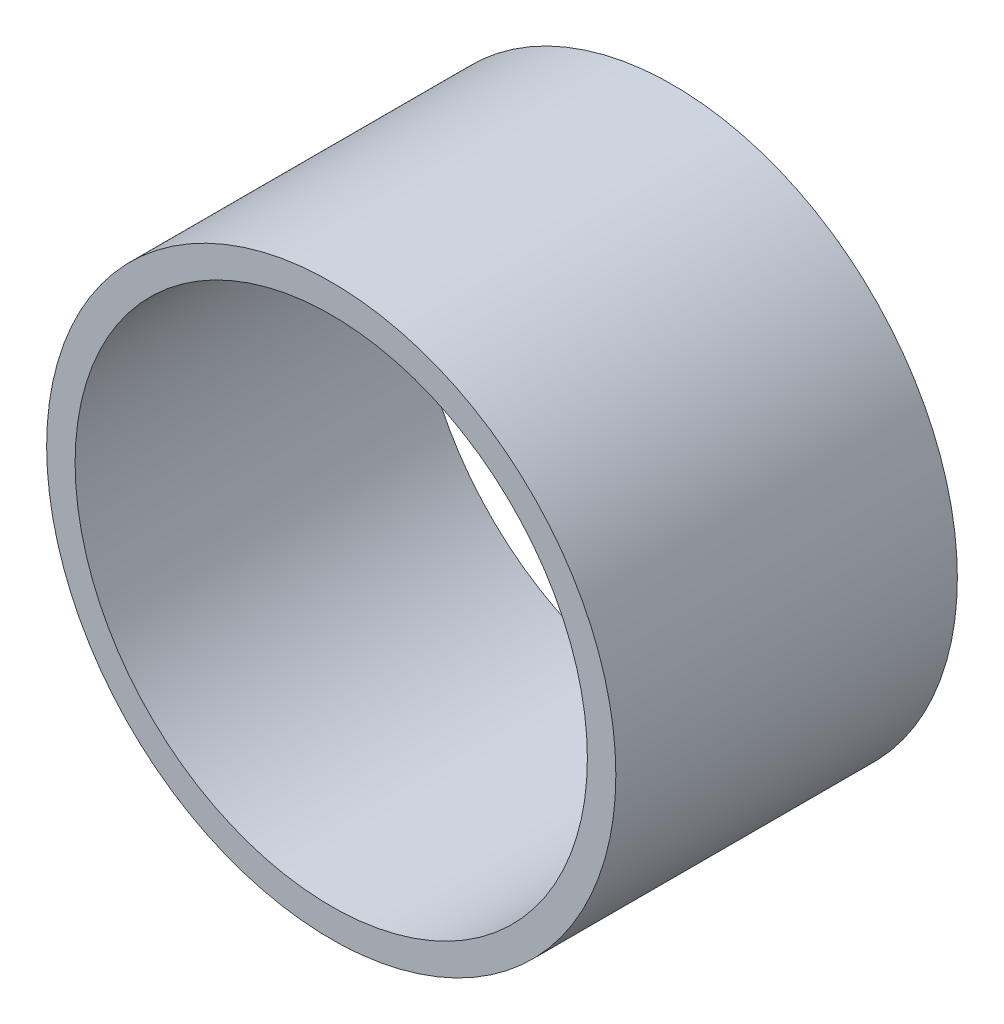
ISO-10303-21;
HEADER;
FILE_DESCRIPTION(('STEP AP214'),'2;1');
FILE_NAME('part.step','',(''),(''),'','','');
FILE_SCHEMA(('AUTOMOTIVE_DESIGN { 1 0 10303 214 1 1 1 1 }'));
ENDSEC;
DATA;
#1=APPLICATION_CONTEXT('core data for automotive mechanical design processes');
#2=APPLICATION_PROTOCOL_DEFINITION('international standard','automotive_design',2000,#1);
#3=PRODUCT_CONTEXT('',#1,'mechanical');
#4=PRODUCT('Part','Part','',(#3));
#5=PRODUCT_RELATED_PRODUCT_CATEGORY('part','',(#4));
#6=PRODUCT_DEFINITION_FORMATION('','',#4);
#7=PRODUCT_DEFINITION_CONTEXT('part definition',#1,'design');
#8=PRODUCT_DEFINITION('design','',#6,#7);
#9=PRODUCT_DEFINITION_SHAPE('','',#8);
#10=(LENGTH_UNIT() NAMED_UNIT(*) SI_UNIT(.MILLI.,.METRE.));
#11=(NAMED_UNIT(*) PLANE_ANGLE_UNIT() SI_UNIT($,.RADIAN.));
#12=(NAMED_UNIT(*) SI_UNIT($,.STERADIAN.) SOLID_ANGLE_UNIT());
#13=UNCERTAINTY_MEASURE_WITH_UNIT(LENGTH_MEASURE(1.E-05),#10,'distance_accuracy_value','');
#14=(GEOMETRIC_REPRESENTATION_CONTEXT(3) GLOBAL_UNCERTAINTY_ASSIGNED_CONTEXT((#13)) GLOBAL_UNIT_ASSIGNED_CONTEXT((#10,
#11,#12)) REPRESENTATION_CONTEXT('',''));
#15=CARTESIAN_POINT('',(0.,0.,0.));
#16=DIRECTION('',(0.,0.,1.));
#17=DIRECTION('',(1.,0.,0.));
#18=AXIS2_PLACEMENT_3D('',#15,#16,#17);
#19=CARTESIAN_POINT('',(0.,0.,30.));
#20=DIRECTION('',(0.,0.,1.));
#21=DIRECTION('',(1.,0.,0.));
#22=AXIS2_PLACEMENT_3D('',#19,#20,#21);
#23=PLANE('',#22);
#24=CARTESIAN_POINT('',(0.,0.,30.));
#25=DIRECTION('',(0.,0.,1.));
#26=DIRECTION('',(1.,0.,0.));
#27=AXIS2_PLACEMENT_3D('',#24,#25,#26);
#28=CIRCLE('',#27,25.);
#29=CARTESIAN_POINT('',(25.,0.,30.));
#30=VERTEX_POINT('',#29);
#31=EDGE_CURVE('E10',#30,#30,#28,.T.);
#32=ORIENTED_EDGE('',*,*,#31,.T.);
#33=EDGE_LOOP('',(#32));
#34=FACE_BOUND('',#33,.T.);
#35=CARTESIAN_POINT('',(0.,0.,30.));
#36=DIRECTION('',(0.,0.,1.));
#37=DIRECTION('',(1.,0.,0.));
#38=AXIS2_PLACEMENT_3D('',#35,#36,#37);
#39=CIRCLE('',#38,22.5);
#40=CARTESIAN_POINT('',(22.5,0.,30.));
#41=VERTEX_POINT('',#40);
#42=EDGE_CURVE('E42',#41,#41,#39,.T.);
#43=ORIENTED_EDGE('',*,*,#42,.F.);
#44=EDGE_LOOP('',(#43));
#45=FACE_BOUND('',#44,.T.);
#46=ADVANCED_FACE('F31',(#34,#45),#23,.T.);
#47=CARTESIAN_POINT('',(0.,0.,0.));
#48=DIRECTION('',(0.,0.,1.));
#49=DIRECTION('',(1.,0.,0.));
#50=AXIS2_PLACEMENT_3D('',#47,#48,#49);
#51=PLANE('',#50);
#52=CARTESIAN_POINT('',(0.,0.,0.));
#53=DIRECTION('',(0.,0.,1.));
#54=DIRECTION('',(1.,0.,0.));
#55=AXIS2_PLACEMENT_3D('',#52,#53,#54);
#56=CIRCLE('',#55,25.);
#57=CARTESIAN_POINT('',(25.,0.,0.));
#58=VERTEX_POINT('',#57);
#59=EDGE_CURVE('E35',#58,#58,#56,.T.);
#60=ORIENTED_EDGE('',*,*,#59,.F.);
#61=EDGE_LOOP('',(#60));
#62=FACE_BOUND('',#61,.T.);
#63=CARTESIAN_POINT('',(0.,0.,0.));
#64=DIRECTION('',(0.,0.,1.));
#65=DIRECTION('',(1.,0.,0.));
#66=AXIS2_PLACEMENT_3D('',#63,#64,#65);
#67=CIRCLE('',#66,22.5);
#68=CARTESIAN_POINT('',(22.5,0.,0.));
#69=VERTEX_POINT('',#68);
#70=EDGE_CURVE('E44',#69,#69,#67,.T.);
#71=ORIENTED_EDGE('',*,*,#70,.T.);
#72=EDGE_LOOP('',(#71));
#73=FACE_BOUND('',#72,.T.);
#74=ADVANCED_FACE('F54',(#62,#73),#51,.F.);
#75=CARTESIAN_POINT('',(0.,0.,30.));
#76=DIRECTION('',(0.,0.,-1.));
#77=DIRECTION('',(-1.,0.,0.));
#78=AXIS2_PLACEMENT_3D('',#75,#76,#77);
#79=CYLINDRICAL_SURFACE('',#78,25.);
#80=ORIENTED_EDGE('',*,*,#31,.F.);
#81=EDGE_LOOP('',(#80));
#82=FACE_BOUND('',#81,.T.);
#83=ORIENTED_EDGE('',*,*,#59,.T.);
#84=EDGE_LOOP('',(#83));
#85=FACE_BOUND('',#84,.T.);
#86=ADVANCED_FACE('F33',(#82,#85),#79,.T.);
#87=CARTESIAN_POINT('',(0.,0.,30.));
#88=DIRECTION('',(0.,0.,-1.));
#89=DIRECTION('',(-1.,0.,0.));
#90=AXIS2_PLACEMENT_3D('',#87,#88,#89);
#91=CYLINDRICAL_SURFACE('',#90,22.5);
#92=ORIENTED_EDGE('',*,*,#42,.T.);
#93=EDGE_LOOP('',(#92));
#94=FACE_BOUND('',#93,.T.);
#95=ORIENTED_EDGE('',*,*,#70,.F.);
#96=EDGE_LOOP('',(#95));
#97=FACE_BOUND('',#96,.T.);
#98=ADVANCED_FACE('F50',(#94,#97),#91,.F.);
#99=CLOSED_SHELL('',(#46,#74,#86,#98));
#100=MANIFOLD_SOLID_BREP('B2',#99);
#101=ADVANCED_BREP_SHAPE_REPRESENTATION('',(#18,#100),#14);
#102=SHAPE_DEFINITION_REPRESENTATION(#9,#101);
ENDSEC;
END-ISO-10303-21;
